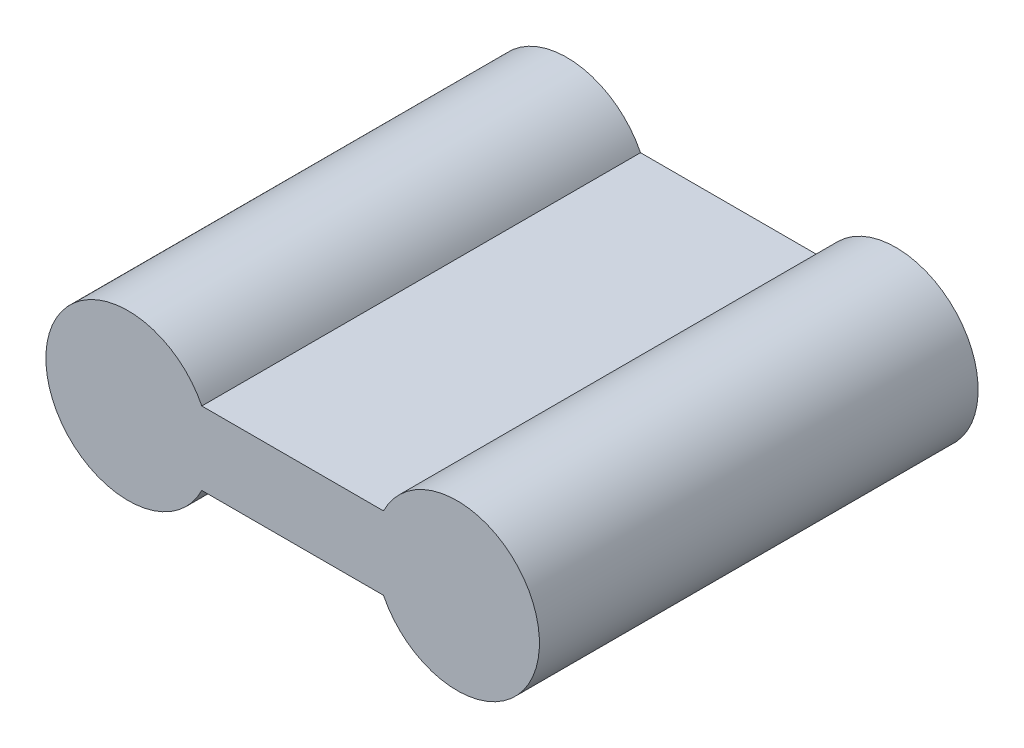
ISO-10303-21;
HEADER;
FILE_DESCRIPTION(('STEP AP214'),'2;1');
FILE_NAME('part.step','',(''),(''),'','','');
FILE_SCHEMA(('AUTOMOTIVE_DESIGN { 1 0 10303 214 1 1 1 1 }'));
ENDSEC;
DATA;
#1=APPLICATION_CONTEXT('core data for automotive mechanical design processes');
#2=APPLICATION_PROTOCOL_DEFINITION('international standard','automotive_design',2000,#1);
#3=PRODUCT_CONTEXT('',#1,'mechanical');
#4=PRODUCT('Part','Part','',(#3));
#5=PRODUCT_RELATED_PRODUCT_CATEGORY('part','',(#4));
#6=PRODUCT_DEFINITION_FORMATION('','',#4);
#7=PRODUCT_DEFINITION_CONTEXT('part definition',#1,'design');
#8=PRODUCT_DEFINITION('design','',#6,#7);
#9=PRODUCT_DEFINITION_SHAPE('','',#8);
#10=(LENGTH_UNIT() NAMED_UNIT(*) SI_UNIT(.MILLI.,.METRE.));
#11=(NAMED_UNIT(*) PLANE_ANGLE_UNIT() SI_UNIT($,.RADIAN.));
#12=(NAMED_UNIT(*) SI_UNIT($,.STERADIAN.) SOLID_ANGLE_UNIT());
#13=UNCERTAINTY_MEASURE_WITH_UNIT(LENGTH_MEASURE(1.E-05),#10,'distance_accuracy_value','');
#14=(GEOMETRIC_REPRESENTATION_CONTEXT(3) GLOBAL_UNCERTAINTY_ASSIGNED_CONTEXT((#13)) GLOBAL_UNIT_ASSIGNED_CONTEXT((#10,
#11,#12)) REPRESENTATION_CONTEXT('',''));
#15=CARTESIAN_POINT('',(0.,0.,0.));
#16=DIRECTION('',(0.,0.,1.));
#17=DIRECTION('',(1.,0.,0.));
#18=AXIS2_PLACEMENT_3D('',#15,#16,#17);
#19=CARTESIAN_POINT('',(9.,0.,12.));
#20=DIRECTION('',(0.,0.,-1.));
#21=DIRECTION('',(-1.,0.,0.));
#22=AXIS2_PLACEMENT_3D('',#19,#20,#21);
#23=CYLINDRICAL_SURFACE('',#22,2.25);
#24=CARTESIAN_POINT('',(9.,0.,0.));
#25=DIRECTION('',(0.,0.,1.));
#26=DIRECTION('',(1.,0.,0.));
#27=AXIS2_PLACEMENT_3D('',#24,#25,#26);
#28=CIRCLE('',#27,2.25);
#29=CARTESIAN_POINT('',(6.98443556292537,-1.,0.));
#30=VERTEX_POINT('',#29);
#31=CARTESIAN_POINT('',(6.98443556292537,1.,0.));
#32=VERTEX_POINT('',#31);
#33=EDGE_CURVE('E99',#30,#32,#28,.T.);
#34=ORIENTED_EDGE('',*,*,#33,.T.);
#35=DIRECTION('',(0.,0.,-1.));
#36=VECTOR('',#35,1.);
#37=CARTESIAN_POINT('',(6.98443556292537,1.,12.));
#38=LINE('',#37,#36);
#39=CARTESIAN_POINT('',(6.98443556292537,1.,12.));
#40=VERTEX_POINT('',#39);
#41=EDGE_CURVE('E11',#40,#32,#38,.T.);
#42=ORIENTED_EDGE('',*,*,#41,.F.);
#43=CARTESIAN_POINT('',(9.,0.,12.));
#44=DIRECTION('',(0.,0.,1.));
#45=DIRECTION('',(1.,0.,0.));
#46=AXIS2_PLACEMENT_3D('',#43,#44,#45);
#47=CIRCLE('',#46,2.25);
#48=CARTESIAN_POINT('',(6.98443556292537,-1.,12.));
#49=VERTEX_POINT('',#48);
#50=EDGE_CURVE('E87',#49,#40,#47,.T.);
#51=ORIENTED_EDGE('',*,*,#50,.F.);
#52=DIRECTION('',(0.,0.,-1.));
#53=VECTOR('',#52,1.);
#54=CARTESIAN_POINT('',(6.98443556292537,-1.,12.));
#55=LINE('',#54,#53);
#56=EDGE_CURVE('E95',#49,#30,#55,.T.);
#57=ORIENTED_EDGE('',*,*,#56,.T.);
#58=EDGE_LOOP('',(#34,#42,#51,#57));
#59=FACE_BOUND('',#58,.T.);
#60=ADVANCED_FACE('F36',(#59),#23,.T.);
#61=CARTESIAN_POINT('',(2.01556443707464,1.,12.));
#62=DIRECTION('',(0.,-1.,0.));
#63=DIRECTION('',(1.,0.,0.));
#64=AXIS2_PLACEMENT_3D('',#61,#62,#63);
#65=PLANE('',#64);
#66=DIRECTION('',(-1.,0.,0.));
#67=VECTOR('',#66,1.);
#68=CARTESIAN_POINT('',(2.01556443707464,1.,0.));
#69=LINE('',#68,#67);
#70=CARTESIAN_POINT('',(2.01556443707464,1.,0.));
#71=VERTEX_POINT('',#70);
#72=EDGE_CURVE('E91',#32,#71,#69,.T.);
#73=ORIENTED_EDGE('',*,*,#72,.T.);
#74=DIRECTION('',(0.,0.,-1.));
#75=VECTOR('',#74,1.);
#76=CARTESIAN_POINT('',(2.01556443707464,1.,12.));
#77=LINE('',#76,#75);
#78=CARTESIAN_POINT('',(2.01556443707464,1.,12.));
#79=VERTEX_POINT('',#78);
#80=EDGE_CURVE('E44',#79,#71,#77,.T.);
#81=ORIENTED_EDGE('',*,*,#80,.F.);
#82=DIRECTION('',(-1.,0.,0.));
#83=VECTOR('',#82,1.);
#84=CARTESIAN_POINT('',(2.01556443707464,1.,12.));
#85=LINE('',#84,#83);
#86=EDGE_CURVE('E82',#40,#79,#85,.T.);
#87=ORIENTED_EDGE('',*,*,#86,.F.);
#88=ORIENTED_EDGE('',*,*,#41,.T.);
#89=EDGE_LOOP('',(#73,#81,#87,#88));
#90=FACE_BOUND('',#89,.T.);
#91=ADVANCED_FACE('F90',(#90),#65,.F.);
#92=CARTESIAN_POINT('',(0.,0.,12.));
#93=DIRECTION('',(0.,0.,-1.));
#94=DIRECTION('',(-1.,0.,0.));
#95=AXIS2_PLACEMENT_3D('',#92,#93,#94);
#96=CYLINDRICAL_SURFACE('',#95,2.25);
#97=CARTESIAN_POINT('',(0.,0.,0.));
#98=DIRECTION('',(0.,0.,1.));
#99=DIRECTION('',(1.,0.,0.));
#100=AXIS2_PLACEMENT_3D('',#97,#98,#99);
#101=CIRCLE('',#100,2.25);
#102=CARTESIAN_POINT('',(2.01556443707464,-0.999999999999999,0.));
#103=VERTEX_POINT('',#102);
#104=EDGE_CURVE('E69',#71,#103,#101,.T.);
#105=ORIENTED_EDGE('',*,*,#104,.T.);
#106=DIRECTION('',(0.,0.,-1.));
#107=VECTOR('',#106,1.);
#108=CARTESIAN_POINT('',(2.01556443707464,-0.999999999999999,12.));
#109=LINE('',#108,#107);
#110=CARTESIAN_POINT('',(2.01556443707464,-0.999999999999999,12.));
#111=VERTEX_POINT('',#110);
#112=EDGE_CURVE('E92',#111,#103,#109,.T.);
#113=ORIENTED_EDGE('',*,*,#112,.F.);
#114=CARTESIAN_POINT('',(0.,0.,12.));
#115=DIRECTION('',(0.,0.,1.));
#116=DIRECTION('',(1.,0.,0.));
#117=AXIS2_PLACEMENT_3D('',#114,#115,#116);
#118=CIRCLE('',#117,2.25);
#119=EDGE_CURVE('E85',#79,#111,#118,.T.);
#120=ORIENTED_EDGE('',*,*,#119,.F.);
#121=ORIENTED_EDGE('',*,*,#80,.T.);
#122=EDGE_LOOP('',(#105,#113,#120,#121));
#123=FACE_BOUND('',#122,.T.);
#124=ADVANCED_FACE('F93',(#123),#96,.T.);
#125=CARTESIAN_POINT('',(2.01556443707464,-1.,12.));
#126=DIRECTION('',(0.,1.,0.));
#127=DIRECTION('',(-1.,0.,0.));
#128=AXIS2_PLACEMENT_3D('',#125,#126,#127);
#129=PLANE('',#128);
#130=DIRECTION('',(1.,0.,0.));
#131=VECTOR('',#130,1.);
#132=CARTESIAN_POINT('',(2.01556443707464,-1.,0.));
#133=LINE('',#132,#131);
#134=EDGE_CURVE('E75',#103,#30,#133,.T.);
#135=ORIENTED_EDGE('',*,*,#134,.T.);
#136=ORIENTED_EDGE('',*,*,#56,.F.);
#137=DIRECTION('',(1.,0.,0.));
#138=VECTOR('',#137,1.);
#139=CARTESIAN_POINT('',(2.01556443707464,-1.,12.));
#140=LINE('',#139,#138);
#141=EDGE_CURVE('E52',#111,#49,#140,.T.);
#142=ORIENTED_EDGE('',*,*,#141,.F.);
#143=ORIENTED_EDGE('',*,*,#112,.T.);
#144=EDGE_LOOP('',(#135,#136,#142,#143));
#145=FACE_BOUND('',#144,.T.);
#146=ADVANCED_FACE('F106',(#145),#129,.F.);
#147=CARTESIAN_POINT('',(9.,0.,12.));
#148=DIRECTION('',(0.,0.,1.));
#149=DIRECTION('',(1.,0.,0.));
#150=AXIS2_PLACEMENT_3D('',#147,#148,#149);
#151=PLANE('',#150);
#152=ORIENTED_EDGE('',*,*,#50,.T.);
#153=ORIENTED_EDGE('',*,*,#86,.T.);
#154=ORIENTED_EDGE('',*,*,#119,.T.);
#155=ORIENTED_EDGE('',*,*,#141,.T.);
#156=EDGE_LOOP('',(#152,#153,#154,#155));
#157=FACE_BOUND('',#156,.T.);
#158=ADVANCED_FACE('F83',(#157),#151,.T.);
#159=CARTESIAN_POINT('',(9.,0.,0.));
#160=DIRECTION('',(0.,0.,1.));
#161=DIRECTION('',(1.,0.,0.));
#162=AXIS2_PLACEMENT_3D('',#159,#160,#161);
#163=PLANE('',#162);
#164=ORIENTED_EDGE('',*,*,#33,.F.);
#165=ORIENTED_EDGE('',*,*,#134,.F.);
#166=ORIENTED_EDGE('',*,*,#104,.F.);
#167=ORIENTED_EDGE('',*,*,#72,.F.);
#168=EDGE_LOOP('',(#164,#165,#166,#167));
#169=FACE_BOUND('',#168,.T.);
#170=ADVANCED_FACE('F109',(#169),#163,.F.);
#171=CLOSED_SHELL('',(#60,#91,#124,#146,#158,#170));
#172=MANIFOLD_SOLID_BREP('B2',#171);
#173=ADVANCED_BREP_SHAPE_REPRESENTATION('',(#18,#172),#14);
#174=SHAPE_DEFINITION_REPRESENTATION(#9,#173);
ENDSEC;
END-ISO-10303-21;
